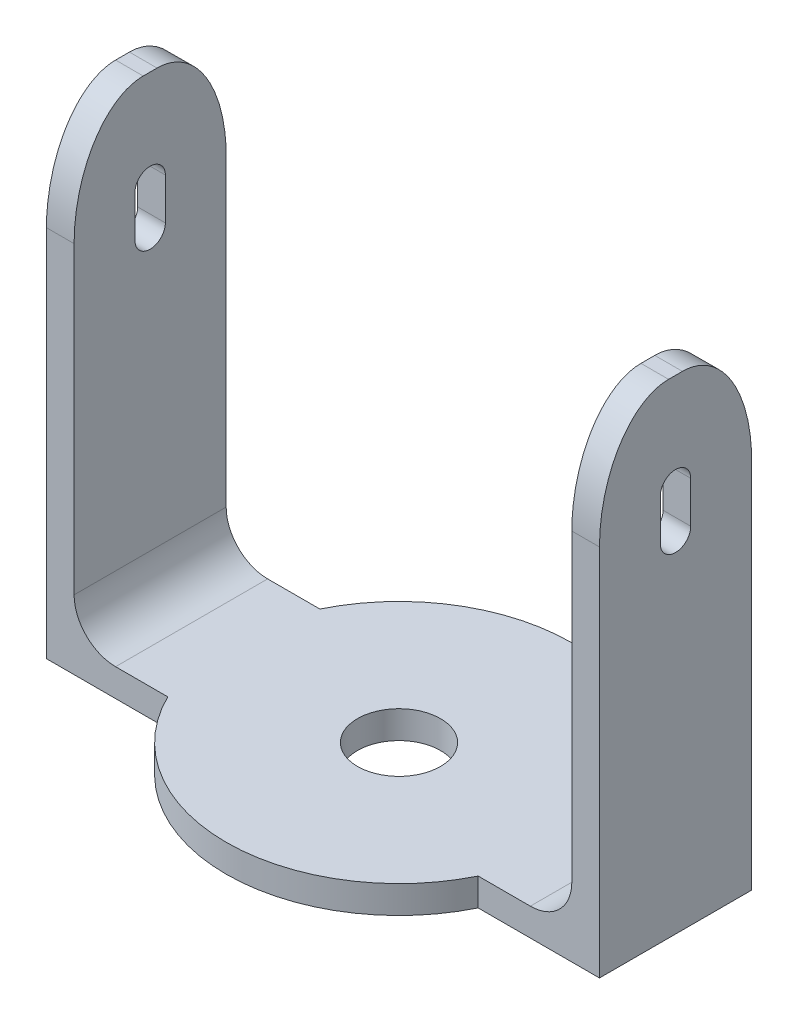
ISO-10303-21;
HEADER;
FILE_DESCRIPTION(('STEP AP214'),'2;1');
FILE_NAME('part.step','',(''),(''),'','','');
FILE_SCHEMA(('AUTOMOTIVE_DESIGN { 1 0 10303 214 1 1 1 1 }'));
ENDSEC;
DATA;
#1=APPLICATION_CONTEXT('core data for automotive mechanical design processes');
#2=APPLICATION_PROTOCOL_DEFINITION('international standard','automotive_design',2000,#1);
#3=PRODUCT_CONTEXT('',#1,'mechanical');
#4=PRODUCT('Part','Part','',(#3));
#5=PRODUCT_RELATED_PRODUCT_CATEGORY('part','',(#4));
#6=PRODUCT_DEFINITION_FORMATION('','',#4);
#7=PRODUCT_DEFINITION_CONTEXT('part definition',#1,'design');
#8=PRODUCT_DEFINITION('design','',#6,#7);
#9=PRODUCT_DEFINITION_SHAPE('','',#8);
#10=(LENGTH_UNIT() NAMED_UNIT(*) SI_UNIT(.MILLI.,.METRE.));
#11=(NAMED_UNIT(*) PLANE_ANGLE_UNIT() SI_UNIT($,.RADIAN.));
#12=(NAMED_UNIT(*) SI_UNIT($,.STERADIAN.) SOLID_ANGLE_UNIT());
#13=UNCERTAINTY_MEASURE_WITH_UNIT(LENGTH_MEASURE(1.E-05),#10,'distance_accuracy_value','');
#14=(GEOMETRIC_REPRESENTATION_CONTEXT(3) GLOBAL_UNCERTAINTY_ASSIGNED_CONTEXT((#13)) GLOBAL_UNIT_ASSIGNED_CONTEXT((#10,
#11,#12)) REPRESENTATION_CONTEXT('',''));
#15=CARTESIAN_POINT('',(0.,0.,0.));
#16=DIRECTION('',(0.,0.,1.));
#17=DIRECTION('',(1.,0.,0.));
#18=AXIS2_PLACEMENT_3D('',#15,#16,#17);
#19=CARTESIAN_POINT('',(0.,2.,0.));
#20=DIRECTION('',(0.,1.,0.));
#21=DIRECTION('',(0.,0.,1.));
#22=AXIS2_PLACEMENT_3D('',#19,#20,#21);
#23=PLANE('',#22);
#24=DIRECTION('',(1.,0.,0.));
#25=VECTOR('',#24,1.);
#26=CARTESIAN_POINT('',(18.,2.,5.5));
#27=LINE('',#26,#25);
#28=CARTESIAN_POINT('',(11.2249721603218,2.,5.5));
#29=VERTEX_POINT('',#28);
#30=CARTESIAN_POINT('',(15.,2.,5.5));
#31=VERTEX_POINT('',#30);
#32=EDGE_CURVE('E831',#29,#31,#27,.T.);
#33=ORIENTED_EDGE('',*,*,#32,.T.);
#34=DIRECTION('',(0.,0.,-1.));
#35=VECTOR('',#34,1.);
#36=CARTESIAN_POINT('',(15.,2.,0.));
#37=LINE('',#36,#35);
#38=CARTESIAN_POINT('',(15.,2.,-5.5));
#39=VERTEX_POINT('',#38);
#40=EDGE_CURVE('E263',#31,#39,#37,.T.);
#41=ORIENTED_EDGE('',*,*,#40,.T.);
#42=DIRECTION('',(-1.,0.,0.));
#43=VECTOR('',#42,1.);
#44=CARTESIAN_POINT('',(18.,2.,-5.5));
#45=LINE('',#44,#43);
#46=CARTESIAN_POINT('',(11.2249721603218,2.,-5.5));
#47=VERTEX_POINT('',#46);
#48=EDGE_CURVE('E316',#39,#47,#45,.T.);
#49=ORIENTED_EDGE('',*,*,#48,.T.);
#50=CARTESIAN_POINT('',(0.,2.,0.));
#51=DIRECTION('',(0.,1.,0.));
#52=DIRECTION('',(0.,0.,1.));
#53=AXIS2_PLACEMENT_3D('',#50,#51,#52);
#54=CIRCLE('',#53,12.5);
#55=CARTESIAN_POINT('',(-11.2249721603218,2.,-5.5));
#56=VERTEX_POINT('',#55);
#57=EDGE_CURVE('E313',#47,#56,#54,.T.);
#58=ORIENTED_EDGE('',*,*,#57,.T.);
#59=DIRECTION('',(-1.,0.,0.));
#60=VECTOR('',#59,1.);
#61=CARTESIAN_POINT('',(-11.2249721603218,2.,-5.5));
#62=LINE('',#61,#60);
#63=CARTESIAN_POINT('',(-15.,2.,-5.5));
#64=VERTEX_POINT('',#63);
#65=EDGE_CURVE('E315',#56,#64,#62,.T.);
#66=ORIENTED_EDGE('',*,*,#65,.T.);
#67=DIRECTION('',(0.,0.,1.));
#68=VECTOR('',#67,1.);
#69=CARTESIAN_POINT('',(-15.,2.,0.));
#70=LINE('',#69,#68);
#71=CARTESIAN_POINT('',(-15.,2.,5.5));
#72=VERTEX_POINT('',#71);
#73=EDGE_CURVE('E259',#64,#72,#70,.T.);
#74=ORIENTED_EDGE('',*,*,#73,.T.);
#75=DIRECTION('',(1.,0.,0.));
#76=VECTOR('',#75,1.);
#77=CARTESIAN_POINT('',(-11.2249721603218,2.,5.5));
#78=LINE('',#77,#76);
#79=CARTESIAN_POINT('',(-11.2249721603218,2.,5.5));
#80=VERTEX_POINT('',#79);
#81=EDGE_CURVE('E839',#72,#80,#78,.T.);
#82=ORIENTED_EDGE('',*,*,#81,.T.);
#83=CARTESIAN_POINT('',(0.,2.,0.));
#84=DIRECTION('',(0.,1.,0.));
#85=DIRECTION('',(0.,0.,1.));
#86=AXIS2_PLACEMENT_3D('',#83,#84,#85);
#87=CIRCLE('',#86,12.5);
#88=EDGE_CURVE('E827',#80,#29,#87,.T.);
#89=ORIENTED_EDGE('',*,*,#88,.T.);
#90=EDGE_LOOP('',(#33,#41,#49,#58,#66,#74,#82,#89));
#91=FACE_BOUND('',#90,.T.);
#92=CARTESIAN_POINT('',(0.,2.,0.));
#93=DIRECTION('',(0.,1.,0.));
#94=DIRECTION('',(0.,0.,1.));
#95=AXIS2_PLACEMENT_3D('',#92,#93,#94);
#96=CIRCLE('',#95,3.);
#97=CARTESIAN_POINT('',(0.,2.,3.));
#98=VERTEX_POINT('',#97);
#99=EDGE_CURVE('E340',#98,#98,#96,.T.);
#100=ORIENTED_EDGE('',*,*,#99,.F.);
#101=EDGE_LOOP('',(#100));
#102=FACE_BOUND('',#101,.T.);
#103=ADVANCED_FACE('F45',(#91,#102),#23,.T.);
#104=CARTESIAN_POINT('',(0.,0.,0.));
#105=DIRECTION('',(0.,1.,0.));
#106=DIRECTION('',(0.,0.,1.));
#107=AXIS2_PLACEMENT_3D('',#104,#105,#106);
#108=PLANE('',#107);
#109=CARTESIAN_POINT('',(0.,0.,0.));
#110=DIRECTION('',(0.,1.,0.));
#111=DIRECTION('',(0.,0.,1.));
#112=AXIS2_PLACEMENT_3D('',#109,#110,#111);
#113=CIRCLE('',#112,12.5);
#114=CARTESIAN_POINT('',(-11.2249721603218,0.,5.5));
#115=VERTEX_POINT('',#114);
#116=CARTESIAN_POINT('',(11.2249721603218,0.,5.5));
#117=VERTEX_POINT('',#116);
#118=EDGE_CURVE('E342',#115,#117,#113,.T.);
#119=ORIENTED_EDGE('',*,*,#118,.F.);
#120=DIRECTION('',(1.,0.,0.));
#121=VECTOR('',#120,1.);
#122=CARTESIAN_POINT('',(-11.2249721603218,0.,5.5));
#123=LINE('',#122,#121);
#124=CARTESIAN_POINT('',(-20.,0.,5.5));
#125=VERTEX_POINT('',#124);
#126=EDGE_CURVE('E832',#125,#115,#123,.T.);
#127=ORIENTED_EDGE('',*,*,#126,.F.);
#128=DIRECTION('',(0.,0.,1.));
#129=VECTOR('',#128,1.);
#130=CARTESIAN_POINT('',(-20.,0.,-5.5));
#131=LINE('',#130,#129);
#132=CARTESIAN_POINT('',(-20.,0.,-5.5));
#133=VERTEX_POINT('',#132);
#134=EDGE_CURVE('E334',#133,#125,#131,.T.);
#135=ORIENTED_EDGE('',*,*,#134,.F.);
#136=DIRECTION('',(-1.,0.,0.));
#137=VECTOR('',#136,1.);
#138=CARTESIAN_POINT('',(-11.2249721603218,0.,-5.5));
#139=LINE('',#138,#137);
#140=CARTESIAN_POINT('',(-11.2249721603218,0.,-5.5));
#141=VERTEX_POINT('',#140);
#142=EDGE_CURVE('E855',#141,#133,#139,.T.);
#143=ORIENTED_EDGE('',*,*,#142,.F.);
#144=CARTESIAN_POINT('',(0.,0.,0.));
#145=DIRECTION('',(0.,1.,0.));
#146=DIRECTION('',(0.,0.,1.));
#147=AXIS2_PLACEMENT_3D('',#144,#145,#146);
#148=CIRCLE('',#147,12.5);
#149=CARTESIAN_POINT('',(11.2249721603218,0.,-5.5));
#150=VERTEX_POINT('',#149);
#151=EDGE_CURVE('E853',#150,#141,#148,.T.);
#152=ORIENTED_EDGE('',*,*,#151,.F.);
#153=DIRECTION('',(-1.,0.,0.));
#154=VECTOR('',#153,1.);
#155=CARTESIAN_POINT('',(18.,0.,-5.5));
#156=LINE('',#155,#154);
#157=CARTESIAN_POINT('',(20.,0.,-5.5));
#158=VERTEX_POINT('',#157);
#159=EDGE_CURVE('E850',#158,#150,#156,.T.);
#160=ORIENTED_EDGE('',*,*,#159,.F.);
#161=DIRECTION('',(0.,0.,-1.));
#162=VECTOR('',#161,1.);
#163=CARTESIAN_POINT('',(20.,0.,-5.5));
#164=LINE('',#163,#162);
#165=CARTESIAN_POINT('',(20.,0.,5.5));
#166=VERTEX_POINT('',#165);
#167=EDGE_CURVE('E384',#166,#158,#164,.T.);
#168=ORIENTED_EDGE('',*,*,#167,.F.);
#169=DIRECTION('',(1.,0.,0.));
#170=VECTOR('',#169,1.);
#171=CARTESIAN_POINT('',(18.,0.,5.5));
#172=LINE('',#171,#170);
#173=EDGE_CURVE('E846',#117,#166,#172,.T.);
#174=ORIENTED_EDGE('',*,*,#173,.F.);
#175=EDGE_LOOP('',(#119,#127,#135,#143,#152,#160,#168,#174));
#176=FACE_BOUND('',#175,.T.);
#177=CARTESIAN_POINT('',(0.,0.,0.));
#178=DIRECTION('',(0.,1.,0.));
#179=DIRECTION('',(0.,0.,1.));
#180=AXIS2_PLACEMENT_3D('',#177,#178,#179);
#181=CIRCLE('',#180,3.);
#182=CARTESIAN_POINT('',(0.,0.,3.));
#183=VERTEX_POINT('',#182);
#184=EDGE_CURVE('E343',#183,#183,#181,.T.);
#185=ORIENTED_EDGE('',*,*,#184,.T.);
#186=EDGE_LOOP('',(#185));
#187=FACE_BOUND('',#186,.T.);
#188=ADVANCED_FACE('F573',(#176,#187),#108,.F.);
#189=CARTESIAN_POINT('',(0.,2.,0.));
#190=DIRECTION('',(0.,-1.,0.));
#191=DIRECTION('',(0.,0.,-1.));
#192=AXIS2_PLACEMENT_3D('',#189,#190,#191);
#193=CYLINDRICAL_SURFACE('',#192,12.5);
#194=ORIENTED_EDGE('',*,*,#118,.T.);
#195=DIRECTION('',(0.,-1.,0.));
#196=VECTOR('',#195,1.);
#197=CARTESIAN_POINT('',(11.2249721603218,2.,5.5));
#198=LINE('',#197,#196);
#199=EDGE_CURVE('E396',#29,#117,#198,.T.);
#200=ORIENTED_EDGE('',*,*,#199,.F.);
#201=ORIENTED_EDGE('',*,*,#88,.F.);
#202=DIRECTION('',(0.,-1.,0.));
#203=VECTOR('',#202,1.);
#204=CARTESIAN_POINT('',(-11.2249721603218,2.,5.5));
#205=LINE('',#204,#203);
#206=EDGE_CURVE('E842',#80,#115,#205,.T.);
#207=ORIENTED_EDGE('',*,*,#206,.T.);
#208=EDGE_LOOP('',(#194,#200,#201,#207));
#209=FACE_BOUND('',#208,.T.);
#210=ADVANCED_FACE('F483',(#209),#193,.T.);
#211=CARTESIAN_POINT('',(18.,2.,5.5));
#212=DIRECTION('',(0.,0.,-1.));
#213=DIRECTION('',(-1.,0.,0.));
#214=AXIS2_PLACEMENT_3D('',#211,#212,#213);
#215=PLANE('',#214);
#216=DIRECTION('',(0.,-1.,0.));
#217=VECTOR('',#216,1.);
#218=CARTESIAN_POINT('',(20.,35.,5.5));
#219=LINE('',#218,#217);
#220=CARTESIAN_POINT('',(20.,27.,5.5));
#221=VERTEX_POINT('',#220);
#222=EDGE_CURVE('E311',#221,#166,#219,.T.);
#223=ORIENTED_EDGE('',*,*,#222,.F.);
#224=CARTESIAN_POINT('',(17.9,27.,5.5));
#225=CARTESIAN_POINT('',(18.6333333333333,27.,5.5));
#226=CARTESIAN_POINT('',(19.3666666666667,27.,5.5));
#227=CARTESIAN_POINT('',(20.1,27.,5.5));
#228=(BOUNDED_CURVE() B_SPLINE_CURVE(3,(#224,#225,#226,#227),.UNSPECIFIED.,.F.,
.F.) B_SPLINE_CURVE_WITH_KNOTS((4,4),(0.0179,0.0201),
.UNSPECIFIED.) CURVE() GEOMETRIC_REPRESENTATION_ITEM() RATIONAL_B_SPLINE_CURVE((1.,1.,1.,1.)) REPRESENTATION_ITEM(''));
#229=CARTESIAN_POINT('',(18.,27.,5.5));
#230=VERTEX_POINT('',#229);
#231=EDGE_CURVE('E673',#221,#230,#228,.F.);
#232=ORIENTED_EDGE('',*,*,#231,.T.);
#233=DIRECTION('',(0.,-1.,0.));
#234=VECTOR('',#233,1.);
#235=CARTESIAN_POINT('',(18.,35.,5.5));
#236=LINE('',#235,#234);
#237=CARTESIAN_POINT('',(18.,5.,5.5));
#238=VERTEX_POINT('',#237);
#239=EDGE_CURVE('E307',#230,#238,#236,.T.);
#240=ORIENTED_EDGE('',*,*,#239,.T.);
#241=CARTESIAN_POINT('',(15.,5.,5.5));
#242=DIRECTION('',(0.,0.,-1.));
#243=DIRECTION('',(-1.,0.,0.));
#244=AXIS2_PLACEMENT_3D('',#241,#242,#243);
#245=CIRCLE('',#244,3.);
#246=EDGE_CURVE('E275',#238,#31,#245,.T.);
#247=ORIENTED_EDGE('',*,*,#246,.T.);
#248=ORIENTED_EDGE('',*,*,#32,.F.);
#249=ORIENTED_EDGE('',*,*,#199,.T.);
#250=ORIENTED_EDGE('',*,*,#173,.T.);
#251=EDGE_LOOP('',(#223,#232,#240,#247,#248,#249,#250));
#252=FACE_BOUND('',#251,.T.);
#253=ADVANCED_FACE('F478',(#252),#215,.F.);
#254=CARTESIAN_POINT('',(18.,2.,-5.5));
#255=DIRECTION('',(0.,0.,1.));
#256=DIRECTION('',(1.,0.,0.));
#257=AXIS2_PLACEMENT_3D('',#254,#255,#256);
#258=PLANE('',#257);
#259=DIRECTION('',(0.,-1.,0.));
#260=VECTOR('',#259,1.);
#261=CARTESIAN_POINT('',(18.,35.,-5.5));
#262=LINE('',#261,#260);
#263=CARTESIAN_POINT('',(18.,27.,-5.5));
#264=VERTEX_POINT('',#263);
#265=CARTESIAN_POINT('',(18.,5.,-5.5));
#266=VERTEX_POINT('',#265);
#267=EDGE_CURVE('E310',#264,#266,#262,.T.);
#268=ORIENTED_EDGE('',*,*,#267,.F.);
#269=CARTESIAN_POINT('',(20.1,27.,-5.5));
#270=CARTESIAN_POINT('',(19.3666666666667,27.,-5.5));
#271=CARTESIAN_POINT('',(18.6333333333333,27.,-5.5));
#272=CARTESIAN_POINT('',(17.9,27.,-5.5));
#273=(BOUNDED_CURVE() B_SPLINE_CURVE(3,(#269,#270,#271,#272),.UNSPECIFIED.,.F.,
.F.) B_SPLINE_CURVE_WITH_KNOTS((4,4),(-0.0201,-0.0179),
.UNSPECIFIED.) CURVE() GEOMETRIC_REPRESENTATION_ITEM() RATIONAL_B_SPLINE_CURVE((1.,1.,1.,1.)) REPRESENTATION_ITEM(''));
#274=CARTESIAN_POINT('',(20.,27.,-5.5));
#275=VERTEX_POINT('',#274);
#276=EDGE_CURVE('E460',#264,#275,#273,.F.);
#277=ORIENTED_EDGE('',*,*,#276,.T.);
#278=DIRECTION('',(0.,-1.,0.));
#279=VECTOR('',#278,1.);
#280=CARTESIAN_POINT('',(20.,35.,-5.5));
#281=LINE('',#280,#279);
#282=EDGE_CURVE('E338',#275,#158,#281,.T.);
#283=ORIENTED_EDGE('',*,*,#282,.T.);
#284=ORIENTED_EDGE('',*,*,#159,.T.);
#285=DIRECTION('',(0.,-1.,0.));
#286=VECTOR('',#285,1.);
#287=CARTESIAN_POINT('',(11.2249721603218,2.,-5.5));
#288=LINE('',#287,#286);
#289=EDGE_CURVE('E867',#47,#150,#288,.T.);
#290=ORIENTED_EDGE('',*,*,#289,.F.);
#291=ORIENTED_EDGE('',*,*,#48,.F.);
#292=CARTESIAN_POINT('',(15.,5.,-5.5));
#293=DIRECTION('',(0.,0.,1.));
#294=DIRECTION('',(1.,0.,0.));
#295=AXIS2_PLACEMENT_3D('',#292,#293,#294);
#296=CIRCLE('',#295,3.);
#297=EDGE_CURVE('E272',#39,#266,#296,.T.);
#298=ORIENTED_EDGE('',*,*,#297,.T.);
#299=EDGE_LOOP('',(#268,#277,#283,#284,#290,#291,#298));
#300=FACE_BOUND('',#299,.T.);
#301=ADVANCED_FACE('F467',(#300),#258,.F.);
#302=CARTESIAN_POINT('',(0.,2.,0.));
#303=DIRECTION('',(0.,-1.,0.));
#304=DIRECTION('',(0.,0.,-1.));
#305=AXIS2_PLACEMENT_3D('',#302,#303,#304);
#306=CYLINDRICAL_SURFACE('',#305,12.5);
#307=ORIENTED_EDGE('',*,*,#151,.T.);
#308=DIRECTION('',(0.,-1.,0.));
#309=VECTOR('',#308,1.);
#310=CARTESIAN_POINT('',(-11.2249721603218,2.,-5.5));
#311=LINE('',#310,#309);
#312=EDGE_CURVE('E864',#56,#141,#311,.T.);
#313=ORIENTED_EDGE('',*,*,#312,.F.);
#314=ORIENTED_EDGE('',*,*,#57,.F.);
#315=ORIENTED_EDGE('',*,*,#289,.T.);
#316=EDGE_LOOP('',(#307,#313,#314,#315));
#317=FACE_BOUND('',#316,.T.);
#318=ADVANCED_FACE('F477',(#317),#306,.T.);
#319=CARTESIAN_POINT('',(-11.2249721603218,2.,-5.5));
#320=DIRECTION('',(0.,0.,1.));
#321=DIRECTION('',(1.,0.,0.));
#322=AXIS2_PLACEMENT_3D('',#319,#320,#321);
#323=PLANE('',#322);
#324=DIRECTION('',(0.,-1.,0.));
#325=VECTOR('',#324,1.);
#326=CARTESIAN_POINT('',(-20.,35.,-5.5));
#327=LINE('',#326,#325);
#328=CARTESIAN_POINT('',(-20.,27.,-5.5));
#329=VERTEX_POINT('',#328);
#330=EDGE_CURVE('E332',#329,#133,#327,.T.);
#331=ORIENTED_EDGE('',*,*,#330,.F.);
#332=CARTESIAN_POINT('',(-17.9,27.,-5.5));
#333=CARTESIAN_POINT('',(-18.6333333333333,27.,-5.5));
#334=CARTESIAN_POINT('',(-19.3666666666667,27.,-5.5));
#335=CARTESIAN_POINT('',(-20.1,27.,-5.5));
#336=(BOUNDED_CURVE() B_SPLINE_CURVE(3,(#332,#333,#334,#335),.UNSPECIFIED.,.F.,
.F.) B_SPLINE_CURVE_WITH_KNOTS((4,4),(-0.0201,-0.0179),
.UNSPECIFIED.) CURVE() GEOMETRIC_REPRESENTATION_ITEM() RATIONAL_B_SPLINE_CURVE((1.,1.,1.,1.)) REPRESENTATION_ITEM(''));
#337=CARTESIAN_POINT('',(-18.,27.,-5.5));
#338=VERTEX_POINT('',#337);
#339=EDGE_CURVE('E286',#329,#338,#336,.F.);
#340=ORIENTED_EDGE('',*,*,#339,.T.);
#341=DIRECTION('',(0.,-1.,0.));
#342=VECTOR('',#341,1.);
#343=CARTESIAN_POINT('',(-18.,35.,-5.5));
#344=LINE('',#343,#342);
#345=CARTESIAN_POINT('',(-18.,5.,-5.5));
#346=VERTEX_POINT('',#345);
#347=EDGE_CURVE('E284',#338,#346,#344,.T.);
#348=ORIENTED_EDGE('',*,*,#347,.T.);
#349=CARTESIAN_POINT('',(-15.,5.,-5.5));
#350=DIRECTION('',(0.,0.,1.));
#351=DIRECTION('',(1.,0.,0.));
#352=AXIS2_PLACEMENT_3D('',#349,#350,#351);
#353=CIRCLE('',#352,3.);
#354=EDGE_CURVE('E12',#346,#64,#353,.T.);
#355=ORIENTED_EDGE('',*,*,#354,.T.);
#356=ORIENTED_EDGE('',*,*,#65,.F.);
#357=ORIENTED_EDGE('',*,*,#312,.T.);
#358=ORIENTED_EDGE('',*,*,#142,.T.);
#359=EDGE_LOOP('',(#331,#340,#348,#355,#356,#357,#358));
#360=FACE_BOUND('',#359,.T.);
#361=ADVANCED_FACE('F560',(#360),#323,.F.);
#362=CARTESIAN_POINT('',(-11.2249721603218,2.,5.5));
#363=DIRECTION('',(0.,0.,-1.));
#364=DIRECTION('',(-1.,0.,0.));
#365=AXIS2_PLACEMENT_3D('',#362,#363,#364);
#366=PLANE('',#365);
#367=DIRECTION('',(0.,-1.,0.));
#368=VECTOR('',#367,1.);
#369=CARTESIAN_POINT('',(-18.,35.,5.5));
#370=LINE('',#369,#368);
#371=CARTESIAN_POINT('',(-18.,27.,5.5));
#372=VERTEX_POINT('',#371);
#373=CARTESIAN_POINT('',(-18.,5.,5.5));
#374=VERTEX_POINT('',#373);
#375=EDGE_CURVE('E281',#372,#374,#370,.T.);
#376=ORIENTED_EDGE('',*,*,#375,.F.);
#377=CARTESIAN_POINT('',(-20.1,27.,5.5));
#378=CARTESIAN_POINT('',(-19.3666666666667,27.,5.5));
#379=CARTESIAN_POINT('',(-18.6333333333333,27.,5.5));
#380=CARTESIAN_POINT('',(-17.9,27.,5.5));
#381=(BOUNDED_CURVE() B_SPLINE_CURVE(3,(#377,#378,#379,#380),.UNSPECIFIED.,.F.,
.F.) B_SPLINE_CURVE_WITH_KNOTS((4,4),(0.0179,0.0201),
.UNSPECIFIED.) CURVE() GEOMETRIC_REPRESENTATION_ITEM() RATIONAL_B_SPLINE_CURVE((1.,1.,1.,1.)) REPRESENTATION_ITEM(''));
#382=CARTESIAN_POINT('',(-20.,27.,5.5));
#383=VERTEX_POINT('',#382);
#384=EDGE_CURVE('E231',#372,#383,#381,.F.);
#385=ORIENTED_EDGE('',*,*,#384,.T.);
#386=DIRECTION('',(0.,-1.,0.));
#387=VECTOR('',#386,1.);
#388=CARTESIAN_POINT('',(-20.,35.,5.5));
#389=LINE('',#388,#387);
#390=EDGE_CURVE('E283',#383,#125,#389,.T.);
#391=ORIENTED_EDGE('',*,*,#390,.T.);
#392=ORIENTED_EDGE('',*,*,#126,.T.);
#393=ORIENTED_EDGE('',*,*,#206,.F.);
#394=ORIENTED_EDGE('',*,*,#81,.F.);
#395=CARTESIAN_POINT('',(-15.,5.,5.5));
#396=DIRECTION('',(0.,0.,-1.));
#397=DIRECTION('',(-1.,0.,0.));
#398=AXIS2_PLACEMENT_3D('',#395,#396,#397);
#399=CIRCLE('',#398,3.);
#400=EDGE_CURVE('E54',#72,#374,#399,.T.);
#401=ORIENTED_EDGE('',*,*,#400,.T.);
#402=EDGE_LOOP('',(#376,#385,#391,#392,#393,#394,#401));
#403=FACE_BOUND('',#402,.T.);
#404=ADVANCED_FACE('F569',(#403),#366,.F.);
#405=CARTESIAN_POINT('',(0.,2.,0.));
#406=DIRECTION('',(0.,-1.,0.));
#407=DIRECTION('',(0.,0.,-1.));
#408=AXIS2_PLACEMENT_3D('',#405,#406,#407);
#409=CYLINDRICAL_SURFACE('',#408,3.);
#410=ORIENTED_EDGE('',*,*,#99,.T.);
#411=EDGE_LOOP('',(#410));
#412=FACE_BOUND('',#411,.T.);
#413=ORIENTED_EDGE('',*,*,#184,.F.);
#414=EDGE_LOOP('',(#413));
#415=FACE_BOUND('',#414,.T.);
#416=ADVANCED_FACE('F539',(#412,#415),#409,.F.);
#417=CARTESIAN_POINT('',(-20.,35.,-5.5));
#418=DIRECTION('',(1.,0.,0.));
#419=DIRECTION('',(0.,0.,-1.));
#420=AXIS2_PLACEMENT_3D('',#417,#418,#419);
#421=PLANE('',#420);
#422=DIRECTION('',(0.,1.,0.));
#423=VECTOR('',#422,1.);
#424=CARTESIAN_POINT('',(-20.,35.,-1.1));
#425=LINE('',#424,#423);
#426=CARTESIAN_POINT('',(-20.,25.,-1.1));
#427=VERTEX_POINT('',#426);
#428=CARTESIAN_POINT('',(-20.,28.,-1.1));
#429=VERTEX_POINT('',#428);
#430=EDGE_CURVE('E299',#427,#429,#425,.T.);
#431=ORIENTED_EDGE('',*,*,#430,.T.);
#432=CARTESIAN_POINT('',(-20.,28.,0.));
#433=DIRECTION('',(1.,0.,0.));
#434=DIRECTION('',(0.,0.,-1.));
#435=AXIS2_PLACEMENT_3D('',#432,#433,#434);
#436=CIRCLE('',#435,1.1);
#437=CARTESIAN_POINT('',(-20.,28.,1.1));
#438=VERTEX_POINT('',#437);
#439=EDGE_CURVE('E304',#429,#438,#436,.T.);
#440=ORIENTED_EDGE('',*,*,#439,.T.);
#441=DIRECTION('',(0.,-1.,0.));
#442=VECTOR('',#441,1.);
#443=CARTESIAN_POINT('',(-20.,35.,1.1));
#444=LINE('',#443,#442);
#445=CARTESIAN_POINT('',(-20.,25.,1.1));
#446=VERTEX_POINT('',#445);
#447=EDGE_CURVE('E374',#438,#446,#444,.T.);
#448=ORIENTED_EDGE('',*,*,#447,.T.);
#449=CARTESIAN_POINT('',(-20.,25.,0.));
#450=DIRECTION('',(1.,0.,0.));
#451=DIRECTION('',(0.,0.,-1.));
#452=AXIS2_PLACEMENT_3D('',#449,#450,#451);
#453=CIRCLE('',#452,1.1);
#454=EDGE_CURVE('E365',#446,#427,#453,.T.);
#455=ORIENTED_EDGE('',*,*,#454,.T.);
#456=EDGE_LOOP('',(#431,#440,#448,#455));
#457=FACE_BOUND('',#456,.T.);
#458=DIRECTION('',(0.,0.,1.));
#459=VECTOR('',#458,1.);
#460=CARTESIAN_POINT('',(-20.,35.,-5.5));
#461=LINE('',#460,#459);
#462=CARTESIAN_POINT('',(-20.,35.,-0.499999999999999));
#463=VERTEX_POINT('',#462);
#464=CARTESIAN_POINT('',(-20.,35.,0.5));
#465=VERTEX_POINT('',#464);
#466=EDGE_CURVE('E337',#463,#465,#461,.T.);
#467=ORIENTED_EDGE('',*,*,#466,.F.);
#468=CARTESIAN_POINT('',(-20.,27.,-5.5));
#469=CARTESIAN_POINT('',(-20.,35.,-5.5));
#470=CARTESIAN_POINT('',(-20.,35.,-0.499999999999998));
#471=(BOUNDED_CURVE() B_SPLINE_CURVE(2,(#468,#469,#470),.UNSPECIFIED.,.F.,
.F.) B_SPLINE_CURVE_WITH_KNOTS((3,3),(0.,1.),
.UNSPECIFIED.) CURVE() GEOMETRIC_REPRESENTATION_ITEM() RATIONAL_B_SPLINE_CURVE((1.,
0.707106781186547,1.)) REPRESENTATION_ITEM(''));
#472=EDGE_CURVE('E289',#463,#329,#471,.F.);
#473=ORIENTED_EDGE('',*,*,#472,.T.);
#474=ORIENTED_EDGE('',*,*,#330,.T.);
#475=ORIENTED_EDGE('',*,*,#134,.T.);
#476=ORIENTED_EDGE('',*,*,#390,.F.);
#477=CARTESIAN_POINT('',(-20.,35.,0.500000000000001));
#478=CARTESIAN_POINT('',(-20.,35.,5.50000000000001));
#479=CARTESIAN_POINT('',(-20.,27.,5.5));
#480=(BOUNDED_CURVE() B_SPLINE_CURVE(2,(#477,#478,#479),.UNSPECIFIED.,.F.,
.F.) B_SPLINE_CURVE_WITH_KNOTS((3,3),(0.,1.),
.UNSPECIFIED.) CURVE() GEOMETRIC_REPRESENTATION_ITEM() RATIONAL_B_SPLINE_CURVE((1.,
0.707106781186547,1.)) REPRESENTATION_ITEM(''));
#481=EDGE_CURVE('E329',#383,#465,#480,.F.);
#482=ORIENTED_EDGE('',*,*,#481,.T.);
#483=EDGE_LOOP('',(#467,#473,#474,#475,#476,#482));
#484=FACE_BOUND('',#483,.T.);
#485=ADVANCED_FACE('F528',(#457,#484),#421,.F.);
#486=CARTESIAN_POINT('',(-18.,35.,-5.5));
#487=DIRECTION('',(-1.,0.,0.));
#488=DIRECTION('',(0.,0.,1.));
#489=AXIS2_PLACEMENT_3D('',#486,#487,#488);
#490=PLANE('',#489);
#491=DIRECTION('',(0.,1.,0.));
#492=VECTOR('',#491,1.);
#493=CARTESIAN_POINT('',(-18.,35.,1.1));
#494=LINE('',#493,#492);
#495=CARTESIAN_POINT('',(-18.,25.,1.1));
#496=VERTEX_POINT('',#495);
#497=CARTESIAN_POINT('',(-18.,28.,1.1));
#498=VERTEX_POINT('',#497);
#499=EDGE_CURVE('E370',#496,#498,#494,.T.);
#500=ORIENTED_EDGE('',*,*,#499,.T.);
#501=CARTESIAN_POINT('',(-18.,28.,0.));
#502=DIRECTION('',(-1.,0.,0.));
#503=DIRECTION('',(0.,0.,1.));
#504=AXIS2_PLACEMENT_3D('',#501,#502,#503);
#505=CIRCLE('',#504,1.1);
#506=CARTESIAN_POINT('',(-18.,28.,-1.1));
#507=VERTEX_POINT('',#506);
#508=EDGE_CURVE('E301',#498,#507,#505,.T.);
#509=ORIENTED_EDGE('',*,*,#508,.T.);
#510=DIRECTION('',(0.,-1.,0.));
#511=VECTOR('',#510,1.);
#512=CARTESIAN_POINT('',(-18.,35.,-1.1));
#513=LINE('',#512,#511);
#514=CARTESIAN_POINT('',(-18.,25.,-1.1));
#515=VERTEX_POINT('',#514);
#516=EDGE_CURVE('E296',#507,#515,#513,.T.);
#517=ORIENTED_EDGE('',*,*,#516,.T.);
#518=CARTESIAN_POINT('',(-18.,25.,0.));
#519=DIRECTION('',(-1.,0.,0.));
#520=DIRECTION('',(0.,0.,1.));
#521=AXIS2_PLACEMENT_3D('',#518,#519,#520);
#522=CIRCLE('',#521,1.1);
#523=EDGE_CURVE('E361',#515,#496,#522,.T.);
#524=ORIENTED_EDGE('',*,*,#523,.T.);
#525=EDGE_LOOP('',(#500,#509,#517,#524));
#526=FACE_BOUND('',#525,.T.);
#527=ORIENTED_EDGE('',*,*,#375,.T.);
#528=DIRECTION('',(0.,0.,1.));
#529=VECTOR('',#528,1.);
#530=CARTESIAN_POINT('',(-18.,5.,-5.5));
#531=LINE('',#530,#529);
#532=EDGE_CURVE('E67',#374,#346,#531,.F.);
#533=ORIENTED_EDGE('',*,*,#532,.T.);
#534=ORIENTED_EDGE('',*,*,#347,.F.);
#535=CARTESIAN_POINT('',(-18.,35.,-0.499999999999998));
#536=CARTESIAN_POINT('',(-18.,35.,-5.5));
#537=CARTESIAN_POINT('',(-18.,27.,-5.5));
#538=(BOUNDED_CURVE() B_SPLINE_CURVE(2,(#535,#536,#537),.UNSPECIFIED.,.F.,
.F.) B_SPLINE_CURVE_WITH_KNOTS((3,3),(0.,1.),
.UNSPECIFIED.) CURVE() GEOMETRIC_REPRESENTATION_ITEM() RATIONAL_B_SPLINE_CURVE((1.,
0.707106781186547,1.)) REPRESENTATION_ITEM(''));
#539=CARTESIAN_POINT('',(-18.,35.,-0.499999999999998));
#540=VERTEX_POINT('',#539);
#541=EDGE_CURVE('E775',#338,#540,#538,.F.);
#542=ORIENTED_EDGE('',*,*,#541,.T.);
#543=DIRECTION('',(0.,0.,-1.));
#544=VECTOR('',#543,1.);
#545=CARTESIAN_POINT('',(-18.,35.,-5.5));
#546=LINE('',#545,#544);
#547=CARTESIAN_POINT('',(-18.,35.,0.500000000000001));
#548=VERTEX_POINT('',#547);
#549=EDGE_CURVE('E500',#548,#540,#546,.T.);
#550=ORIENTED_EDGE('',*,*,#549,.F.);
#551=CARTESIAN_POINT('',(-18.,27.,5.5));
#552=CARTESIAN_POINT('',(-18.,35.,5.50000000000001));
#553=CARTESIAN_POINT('',(-18.,35.,0.500000000000001));
#554=(BOUNDED_CURVE() B_SPLINE_CURVE(2,(#551,#552,#553),.UNSPECIFIED.,.F.,
.F.) B_SPLINE_CURVE_WITH_KNOTS((3,3),(0.,1.),
.UNSPECIFIED.) CURVE() GEOMETRIC_REPRESENTATION_ITEM() RATIONAL_B_SPLINE_CURVE((1.,
0.707106781186547,1.)) REPRESENTATION_ITEM(''));
#555=EDGE_CURVE('E288',#548,#372,#554,.F.);
#556=ORIENTED_EDGE('',*,*,#555,.T.);
#557=EDGE_LOOP('',(#527,#533,#534,#542,#550,#556));
#558=FACE_BOUND('',#557,.T.);
#559=ADVANCED_FACE('F538',(#526,#558),#490,.F.);
#560=CARTESIAN_POINT('',(0.,35.,0.));
#561=DIRECTION('',(0.,1.,0.));
#562=DIRECTION('',(0.,0.,1.));
#563=AXIS2_PLACEMENT_3D('',#560,#561,#562);
#564=PLANE('',#563);
#565=ORIENTED_EDGE('',*,*,#549,.T.);
#566=CARTESIAN_POINT('',(-20.1,35.,-0.499999999999998));
#567=CARTESIAN_POINT('',(-19.3666666666667,35.,-0.499999999999998));
#568=CARTESIAN_POINT('',(-18.6333333333333,35.,-0.499999999999998));
#569=CARTESIAN_POINT('',(-17.9,35.,-0.499999999999998));
#570=(BOUNDED_CURVE() B_SPLINE_CURVE(3,(#566,#567,#568,#569),.UNSPECIFIED.,.F.,
.F.) B_SPLINE_CURVE_WITH_KNOTS((4,4),(-0.0201,-0.0179),
.UNSPECIFIED.) CURVE() GEOMETRIC_REPRESENTATION_ITEM() RATIONAL_B_SPLINE_CURVE((1.,1.,1.,1.)) REPRESENTATION_ITEM(''));
#571=EDGE_CURVE('E326',#540,#463,#570,.F.);
#572=ORIENTED_EDGE('',*,*,#571,.T.);
#573=ORIENTED_EDGE('',*,*,#466,.T.);
#574=CARTESIAN_POINT('',(-17.9,35.,0.500000000000001));
#575=CARTESIAN_POINT('',(-18.6333333333333,35.,0.500000000000001));
#576=CARTESIAN_POINT('',(-19.3666666666667,35.,0.500000000000001));
#577=CARTESIAN_POINT('',(-20.1,35.,0.500000000000001));
#578=(BOUNDED_CURVE() B_SPLINE_CURVE(3,(#574,#575,#576,#577),.UNSPECIFIED.,.F.,
.F.) B_SPLINE_CURVE_WITH_KNOTS((4,4),(0.0179,0.0201),
.UNSPECIFIED.) CURVE() GEOMETRIC_REPRESENTATION_ITEM() RATIONAL_B_SPLINE_CURVE((1.,1.,1.,1.)) REPRESENTATION_ITEM(''));
#579=EDGE_CURVE('E330',#465,#548,#578,.F.);
#580=ORIENTED_EDGE('',*,*,#579,.T.);
#581=EDGE_LOOP('',(#565,#572,#573,#580));
#582=FACE_BOUND('',#581,.T.);
#583=ADVANCED_FACE('F797',(#582),#564,.T.);
#584=CARTESIAN_POINT('',(20.,35.,-5.5));
#585=DIRECTION('',(-1.,0.,0.));
#586=DIRECTION('',(0.,0.,1.));
#587=AXIS2_PLACEMENT_3D('',#584,#585,#586);
#588=PLANE('',#587);
#589=DIRECTION('',(0.,1.,0.));
#590=VECTOR('',#589,1.);
#591=CARTESIAN_POINT('',(20.,35.,1.1));
#592=LINE('',#591,#590);
#593=CARTESIAN_POINT('',(20.,25.,1.1));
#594=VERTEX_POINT('',#593);
#595=CARTESIAN_POINT('',(20.,28.,1.1));
#596=VERTEX_POINT('',#595);
#597=EDGE_CURVE('E280',#594,#596,#592,.T.);
#598=ORIENTED_EDGE('',*,*,#597,.T.);
#599=CARTESIAN_POINT('',(20.,28.,0.));
#600=DIRECTION('',(-1.,0.,0.));
#601=DIRECTION('',(0.,0.,1.));
#602=AXIS2_PLACEMENT_3D('',#599,#600,#601);
#603=CIRCLE('',#602,1.1);
#604=CARTESIAN_POINT('',(20.,28.,-1.1));
#605=VERTEX_POINT('',#604);
#606=EDGE_CURVE('E305',#596,#605,#603,.T.);
#607=ORIENTED_EDGE('',*,*,#606,.T.);
#608=DIRECTION('',(0.,-1.,0.));
#609=VECTOR('',#608,1.);
#610=CARTESIAN_POINT('',(20.,35.,-1.1));
#611=LINE('',#610,#609);
#612=CARTESIAN_POINT('',(20.,25.,-1.1));
#613=VERTEX_POINT('',#612);
#614=EDGE_CURVE('E293',#605,#613,#611,.T.);
#615=ORIENTED_EDGE('',*,*,#614,.T.);
#616=CARTESIAN_POINT('',(20.,25.,0.));
#617=DIRECTION('',(-1.,0.,0.));
#618=DIRECTION('',(0.,0.,1.));
#619=AXIS2_PLACEMENT_3D('',#616,#617,#618);
#620=CIRCLE('',#619,1.1);
#621=EDGE_CURVE('E238',#613,#594,#620,.T.);
#622=ORIENTED_EDGE('',*,*,#621,.T.);
#623=EDGE_LOOP('',(#598,#607,#615,#622));
#624=FACE_BOUND('',#623,.T.);
#625=ORIENTED_EDGE('',*,*,#282,.F.);
#626=CARTESIAN_POINT('',(20.,35.,-0.500000000000002));
#627=CARTESIAN_POINT('',(20.,35.,-5.50000000000001));
#628=CARTESIAN_POINT('',(20.,27.,-5.5));
#629=(BOUNDED_CURVE() B_SPLINE_CURVE(2,(#626,#627,#628),.UNSPECIFIED.,.F.,
.F.) B_SPLINE_CURVE_WITH_KNOTS((3,3),(0.,1.),
.UNSPECIFIED.) CURVE() GEOMETRIC_REPRESENTATION_ITEM() RATIONAL_B_SPLINE_CURVE((1.,
0.707106781186548,1.)) REPRESENTATION_ITEM(''));
#630=CARTESIAN_POINT('',(20.,35.,-0.500000000000002));
#631=VERTEX_POINT('',#630);
#632=EDGE_CURVE('E802',#275,#631,#629,.F.);
#633=ORIENTED_EDGE('',*,*,#632,.T.);
#634=DIRECTION('',(0.,0.,-1.));
#635=VECTOR('',#634,1.);
#636=CARTESIAN_POINT('',(20.,35.,-5.5));
#637=LINE('',#636,#635);
#638=CARTESIAN_POINT('',(20.,35.,0.499999999999996));
#639=VERTEX_POINT('',#638);
#640=EDGE_CURVE('E390',#639,#631,#637,.T.);
#641=ORIENTED_EDGE('',*,*,#640,.F.);
#642=CARTESIAN_POINT('',(20.,27.,5.5));
#643=CARTESIAN_POINT('',(20.,35.,5.5));
#644=CARTESIAN_POINT('',(20.,35.,0.499999999999996));
#645=(BOUNDED_CURVE() B_SPLINE_CURVE(2,(#642,#643,#644),.UNSPECIFIED.,.F.,
.F.) B_SPLINE_CURVE_WITH_KNOTS((3,3),(0.,1.),
.UNSPECIFIED.) CURVE() GEOMETRIC_REPRESENTATION_ITEM() RATIONAL_B_SPLINE_CURVE((1.,
0.707106781186547,1.)) REPRESENTATION_ITEM(''));
#646=EDGE_CURVE('E644',#639,#221,#645,.F.);
#647=ORIENTED_EDGE('',*,*,#646,.T.);
#648=ORIENTED_EDGE('',*,*,#222,.T.);
#649=ORIENTED_EDGE('',*,*,#167,.T.);
#650=EDGE_LOOP('',(#625,#633,#641,#647,#648,#649));
#651=FACE_BOUND('',#650,.T.);
#652=ADVANCED_FACE('F881',(#624,#651),#588,.F.);
#653=CARTESIAN_POINT('',(18.,35.,-5.5));
#654=DIRECTION('',(1.,0.,0.));
#655=DIRECTION('',(0.,0.,-1.));
#656=AXIS2_PLACEMENT_3D('',#653,#654,#655);
#657=PLANE('',#656);
#658=DIRECTION('',(0.,1.,0.));
#659=VECTOR('',#658,1.);
#660=CARTESIAN_POINT('',(18.,35.,-1.1));
#661=LINE('',#660,#659);
#662=CARTESIAN_POINT('',(18.,25.,-1.1));
#663=VERTEX_POINT('',#662);
#664=CARTESIAN_POINT('',(18.,28.,-1.1));
#665=VERTEX_POINT('',#664);
#666=EDGE_CURVE('E218',#663,#665,#661,.T.);
#667=ORIENTED_EDGE('',*,*,#666,.T.);
#668=CARTESIAN_POINT('',(18.,28.,0.));
#669=DIRECTION('',(1.,0.,0.));
#670=DIRECTION('',(0.,0.,-1.));
#671=AXIS2_PLACEMENT_3D('',#668,#669,#670);
#672=CIRCLE('',#671,1.1);
#673=CARTESIAN_POINT('',(18.,28.,1.1));
#674=VERTEX_POINT('',#673);
#675=EDGE_CURVE('E253',#665,#674,#672,.T.);
#676=ORIENTED_EDGE('',*,*,#675,.T.);
#677=DIRECTION('',(0.,-1.,0.));
#678=VECTOR('',#677,1.);
#679=CARTESIAN_POINT('',(18.,35.,1.1));
#680=LINE('',#679,#678);
#681=CARTESIAN_POINT('',(18.,25.,1.1));
#682=VERTEX_POINT('',#681);
#683=EDGE_CURVE('E247',#674,#682,#680,.T.);
#684=ORIENTED_EDGE('',*,*,#683,.T.);
#685=CARTESIAN_POINT('',(18.,25.,0.));
#686=DIRECTION('',(1.,0.,0.));
#687=DIRECTION('',(0.,0.,-1.));
#688=AXIS2_PLACEMENT_3D('',#685,#686,#687);
#689=CIRCLE('',#688,1.1);
#690=EDGE_CURVE('E230',#682,#663,#689,.T.);
#691=ORIENTED_EDGE('',*,*,#690,.T.);
#692=EDGE_LOOP('',(#667,#676,#684,#691));
#693=FACE_BOUND('',#692,.T.);
#694=ORIENTED_EDGE('',*,*,#267,.T.);
#695=DIRECTION('',(0.,0.,-1.));
#696=VECTOR('',#695,1.);
#697=CARTESIAN_POINT('',(18.,5.,-5.5));
#698=LINE('',#697,#696);
#699=EDGE_CURVE('E267',#266,#238,#698,.F.);
#700=ORIENTED_EDGE('',*,*,#699,.T.);
#701=ORIENTED_EDGE('',*,*,#239,.F.);
#702=CARTESIAN_POINT('',(18.,35.,0.499999999999997));
#703=CARTESIAN_POINT('',(18.,35.,5.5));
#704=CARTESIAN_POINT('',(18.,27.,5.5));
#705=(BOUNDED_CURVE() B_SPLINE_CURVE(2,(#702,#703,#704),.UNSPECIFIED.,.F.,
.F.) B_SPLINE_CURVE_WITH_KNOTS((3,3),(0.,1.),
.UNSPECIFIED.) CURVE() GEOMETRIC_REPRESENTATION_ITEM() RATIONAL_B_SPLINE_CURVE((1.,
0.707106781186547,1.)) REPRESENTATION_ITEM(''));
#706=CARTESIAN_POINT('',(18.,35.,0.499999999999997));
#707=VERTEX_POINT('',#706);
#708=EDGE_CURVE('E322',#230,#707,#705,.F.);
#709=ORIENTED_EDGE('',*,*,#708,.T.);
#710=DIRECTION('',(0.,0.,1.));
#711=VECTOR('',#710,1.);
#712=CARTESIAN_POINT('',(18.,35.,-5.5));
#713=LINE('',#712,#711);
#714=CARTESIAN_POINT('',(18.,35.,-0.500000000000001));
#715=VERTEX_POINT('',#714);
#716=EDGE_CURVE('E395',#715,#707,#713,.T.);
#717=ORIENTED_EDGE('',*,*,#716,.F.);
#718=CARTESIAN_POINT('',(18.,27.,-5.5));
#719=CARTESIAN_POINT('',(18.,35.,-5.50000000000001));
#720=CARTESIAN_POINT('',(18.,35.,-0.500000000000001));
#721=(BOUNDED_CURVE() B_SPLINE_CURVE(2,(#718,#719,#720),.UNSPECIFIED.,.F.,
.F.) B_SPLINE_CURVE_WITH_KNOTS((3,3),(0.,1.),
.UNSPECIFIED.) CURVE() GEOMETRIC_REPRESENTATION_ITEM() RATIONAL_B_SPLINE_CURVE((1.,
0.707106781186547,1.)) REPRESENTATION_ITEM(''));
#722=EDGE_CURVE('E324',#715,#264,#721,.F.);
#723=ORIENTED_EDGE('',*,*,#722,.T.);
#724=EDGE_LOOP('',(#694,#700,#701,#709,#717,#723));
#725=FACE_BOUND('',#724,.T.);
#726=ADVANCED_FACE('F245',(#693,#725),#657,.F.);
#727=CARTESIAN_POINT('',(0.,35.,0.));
#728=DIRECTION('',(0.,-1.,0.));
#729=DIRECTION('',(0.,0.,-1.));
#730=AXIS2_PLACEMENT_3D('',#727,#728,#729);
#731=PLANE('',#730);
#732=ORIENTED_EDGE('',*,*,#640,.T.);
#733=CARTESIAN_POINT('',(17.9,35.,-0.500000000000001));
#734=CARTESIAN_POINT('',(18.6333333333333,35.,-0.500000000000001));
#735=CARTESIAN_POINT('',(19.3666666666667,35.,-0.500000000000002));
#736=CARTESIAN_POINT('',(20.1,35.,-0.500000000000002));
#737=(BOUNDED_CURVE() B_SPLINE_CURVE(3,(#733,#734,#735,#736),.UNSPECIFIED.,.F.,
.F.) B_SPLINE_CURVE_WITH_KNOTS((4,4),(-0.0201,-0.0179),
.UNSPECIFIED.) CURVE() GEOMETRIC_REPRESENTATION_ITEM() RATIONAL_B_SPLINE_CURVE((1.,1.,1.,1.)) REPRESENTATION_ITEM(''));
#738=EDGE_CURVE('E325',#631,#715,#737,.F.);
#739=ORIENTED_EDGE('',*,*,#738,.T.);
#740=ORIENTED_EDGE('',*,*,#716,.T.);
#741=CARTESIAN_POINT('',(20.1,35.,0.499999999999996));
#742=CARTESIAN_POINT('',(19.3666666666667,35.,0.499999999999996));
#743=CARTESIAN_POINT('',(18.6333333333333,35.,0.499999999999997));
#744=CARTESIAN_POINT('',(17.9,35.,0.499999999999997));
#745=(BOUNDED_CURVE() B_SPLINE_CURVE(3,(#741,#742,#743,#744),.UNSPECIFIED.,.F.,
.F.) B_SPLINE_CURVE_WITH_KNOTS((4,4),(0.0179,0.0201),
.UNSPECIFIED.) CURVE() GEOMETRIC_REPRESENTATION_ITEM() RATIONAL_B_SPLINE_CURVE((1.,1.,1.,1.)) REPRESENTATION_ITEM(''));
#746=EDGE_CURVE('E405',#707,#639,#745,.F.);
#747=ORIENTED_EDGE('',*,*,#746,.T.);
#748=EDGE_LOOP('',(#732,#739,#740,#747));
#749=FACE_BOUND('',#748,.T.);
#750=ADVANCED_FACE('F413',(#749),#731,.F.);
#751=CARTESIAN_POINT('',(20.1,35.,-0.500000000000002));
#752=CARTESIAN_POINT('',(19.3666666666667,35.,-0.500000000000002));
#753=CARTESIAN_POINT('',(18.6333333333333,35.,-0.500000000000001));
#754=CARTESIAN_POINT('',(17.9,35.,-0.500000000000001));
#755=CARTESIAN_POINT('',(20.1,35.,-5.50000000000001));
#756=CARTESIAN_POINT('',(19.3666666666667,35.,-5.50000000000001));
#757=CARTESIAN_POINT('',(18.6333333333333,35.,-5.50000000000001));
#758=CARTESIAN_POINT('',(17.9,35.,-5.50000000000001));
#759=CARTESIAN_POINT('',(20.1,27.,-5.5));
#760=CARTESIAN_POINT('',(19.3666666666667,27.,-5.5));
#761=CARTESIAN_POINT('',(18.6333333333333,27.,-5.5));
#762=CARTESIAN_POINT('',(17.9,27.,-5.5));
#763=(BOUNDED_SURFACE() B_SPLINE_SURFACE(2,3,((#751,#752,#753,#754),(#755,#756,#757,#758),(#759,
#760,#761,#762)),.UNSPECIFIED.,.F.,.F.,.F.) B_SPLINE_SURFACE_WITH_KNOTS((3,3),(4,4),(0.,1.),
(-0.0201,-0.0179),.UNSPECIFIED.) GEOMETRIC_REPRESENTATION_ITEM() RATIONAL_B_SPLINE_SURFACE(((1.,
1.,1.,1.),(0.707106781186547,0.707106781186547,0.707106781186547,0.707106781186547),(1.,1.,1.,1.))) REPRESENTATION_ITEM('') SURFACE());
#764=ORIENTED_EDGE('',*,*,#632,.F.);
#765=ORIENTED_EDGE('',*,*,#276,.F.);
#766=ORIENTED_EDGE('',*,*,#722,.F.);
#767=ORIENTED_EDGE('',*,*,#738,.F.);
#768=EDGE_LOOP('',(#764,#765,#766,#767));
#769=FACE_BOUND('',#768,.T.);
#770=ADVANCED_FACE('F423',(#769),#763,.T.);
#771=CARTESIAN_POINT('',(17.9,35.,0.499999999999997));
#772=CARTESIAN_POINT('',(18.6333333333333,35.,0.499999999999997));
#773=CARTESIAN_POINT('',(19.3666666666667,35.,0.499999999999996));
#774=CARTESIAN_POINT('',(20.1,35.,0.499999999999996));
#775=CARTESIAN_POINT('',(17.9,35.,5.5));
#776=CARTESIAN_POINT('',(18.6333333333333,35.,5.5));
#777=CARTESIAN_POINT('',(19.3666666666667,35.,5.5));
#778=CARTESIAN_POINT('',(20.1,35.,5.5));
#779=CARTESIAN_POINT('',(17.9,27.,5.5));
#780=CARTESIAN_POINT('',(18.6333333333333,27.,5.5));
#781=CARTESIAN_POINT('',(19.3666666666667,27.,5.5));
#782=CARTESIAN_POINT('',(20.1,27.,5.5));
#783=(BOUNDED_SURFACE() B_SPLINE_SURFACE(2,3,((#771,#772,#773,#774),(#775,#776,#777,#778),(#779,
#780,#781,#782)),.UNSPECIFIED.,.F.,.F.,.F.) B_SPLINE_SURFACE_WITH_KNOTS((3,3),(4,4),(0.,1.),
(0.0179,0.0201),.UNSPECIFIED.) GEOMETRIC_REPRESENTATION_ITEM() RATIONAL_B_SPLINE_SURFACE(((1.,
1.,1.,1.),(0.707106781186547,0.707106781186547,0.707106781186547,0.707106781186547),(1.,1.,1.,1.))) REPRESENTATION_ITEM('') SURFACE());
#784=ORIENTED_EDGE('',*,*,#708,.F.);
#785=ORIENTED_EDGE('',*,*,#231,.F.);
#786=ORIENTED_EDGE('',*,*,#646,.F.);
#787=ORIENTED_EDGE('',*,*,#746,.F.);
#788=EDGE_LOOP('',(#784,#785,#786,#787));
#789=FACE_BOUND('',#788,.T.);
#790=ADVANCED_FACE('F606',(#789),#783,.T.);
#791=CARTESIAN_POINT('',(-20.1,27.,-5.5));
#792=CARTESIAN_POINT('',(-19.3666666666667,27.,-5.5));
#793=CARTESIAN_POINT('',(-18.6333333333333,27.,-5.5));
#794=CARTESIAN_POINT('',(-17.9,27.,-5.5));
#795=CARTESIAN_POINT('',(-20.1,35.,-5.5));
#796=CARTESIAN_POINT('',(-19.3666666666667,35.,-5.5));
#797=CARTESIAN_POINT('',(-18.6333333333333,35.,-5.5));
#798=CARTESIAN_POINT('',(-17.9,35.,-5.5));
#799=CARTESIAN_POINT('',(-20.1,35.,-0.499999999999998));
#800=CARTESIAN_POINT('',(-19.3666666666667,35.,-0.499999999999998));
#801=CARTESIAN_POINT('',(-18.6333333333333,35.,-0.499999999999998));
#802=CARTESIAN_POINT('',(-17.9,35.,-0.499999999999998));
#803=(BOUNDED_SURFACE() B_SPLINE_SURFACE(2,3,((#791,#792,#793,#794),(#795,#796,#797,#798),(#799,
#800,#801,#802)),.UNSPECIFIED.,.F.,.F.,.F.) B_SPLINE_SURFACE_WITH_KNOTS((3,3),(4,4),(0.,1.),
(-0.0201,-0.0179),.UNSPECIFIED.) GEOMETRIC_REPRESENTATION_ITEM() RATIONAL_B_SPLINE_SURFACE(((1.,
1.,1.,1.),(0.707106781186547,0.707106781186547,0.707106781186547,0.707106781186547),(1.,1.,1.,1.))) REPRESENTATION_ITEM('') SURFACE());
#804=ORIENTED_EDGE('',*,*,#541,.F.);
#805=ORIENTED_EDGE('',*,*,#339,.F.);
#806=ORIENTED_EDGE('',*,*,#472,.F.);
#807=ORIENTED_EDGE('',*,*,#571,.F.);
#808=EDGE_LOOP('',(#804,#805,#806,#807));
#809=FACE_BOUND('',#808,.T.);
#810=ADVANCED_FACE('F690',(#809),#803,.T.);
#811=CARTESIAN_POINT('',(-17.9,27.,5.5));
#812=CARTESIAN_POINT('',(-18.6333333333333,27.,5.5));
#813=CARTESIAN_POINT('',(-19.3666666666667,27.,5.5));
#814=CARTESIAN_POINT('',(-20.1,27.,5.5));
#815=CARTESIAN_POINT('',(-17.9,35.,5.50000000000001));
#816=CARTESIAN_POINT('',(-18.6333333333333,35.,5.50000000000001));
#817=CARTESIAN_POINT('',(-19.3666666666667,35.,5.50000000000001));
#818=CARTESIAN_POINT('',(-20.1,35.,5.50000000000001));
#819=CARTESIAN_POINT('',(-17.9,35.,0.500000000000001));
#820=CARTESIAN_POINT('',(-18.6333333333333,35.,0.500000000000001));
#821=CARTESIAN_POINT('',(-19.3666666666667,35.,0.500000000000001));
#822=CARTESIAN_POINT('',(-20.1,35.,0.500000000000001));
#823=(BOUNDED_SURFACE() B_SPLINE_SURFACE(2,3,((#811,#812,#813,#814),(#815,#816,#817,#818),(#819,
#820,#821,#822)),.UNSPECIFIED.,.F.,.F.,.F.) B_SPLINE_SURFACE_WITH_KNOTS((3,3),(4,4),(0.,1.),
(0.0179,0.0201),.UNSPECIFIED.) GEOMETRIC_REPRESENTATION_ITEM() RATIONAL_B_SPLINE_SURFACE(((1.,
1.,1.,1.),(0.707106781186547,0.707106781186547,0.707106781186547,0.707106781186547),(1.,1.,1.,1.))) REPRESENTATION_ITEM('') SURFACE());
#824=ORIENTED_EDGE('',*,*,#481,.F.);
#825=ORIENTED_EDGE('',*,*,#384,.F.);
#826=ORIENTED_EDGE('',*,*,#555,.F.);
#827=ORIENTED_EDGE('',*,*,#579,.F.);
#828=EDGE_LOOP('',(#824,#825,#826,#827));
#829=FACE_BOUND('',#828,.T.);
#830=ADVANCED_FACE('F703',(#829),#823,.T.);
#831=CARTESIAN_POINT('',(20.04,25.,-1.1));
#832=DIRECTION('',(0.,0.,-1.));
#833=DIRECTION('',(-1.,0.,0.));
#834=AXIS2_PLACEMENT_3D('',#831,#832,#833);
#835=PLANE('',#834);
#836=DIRECTION('',(-1.,0.,0.));
#837=VECTOR('',#836,1.);
#838=CARTESIAN_POINT('',(20.04,28.,-1.1));
#839=LINE('',#838,#837);
#840=EDGE_CURVE('E224',#605,#665,#839,.T.);
#841=ORIENTED_EDGE('',*,*,#840,.T.);
#842=ORIENTED_EDGE('',*,*,#666,.F.);
#843=DIRECTION('',(-1.,0.,0.));
#844=VECTOR('',#843,1.);
#845=CARTESIAN_POINT('',(20.04,25.,-1.1));
#846=LINE('',#845,#844);
#847=EDGE_CURVE('E221',#613,#663,#846,.T.);
#848=ORIENTED_EDGE('',*,*,#847,.F.);
#849=ORIENTED_EDGE('',*,*,#614,.F.);
#850=EDGE_LOOP('',(#841,#842,#848,#849));
#851=FACE_BOUND('',#850,.T.);
#852=ADVANCED_FACE('F220',(#851),#835,.F.);
#853=CARTESIAN_POINT('',(20.04,25.,0.));
#854=DIRECTION('',(-1.,0.,0.));
#855=DIRECTION('',(0.,0.,1.));
#856=AXIS2_PLACEMENT_3D('',#853,#854,#855);
#857=CYLINDRICAL_SURFACE('',#856,1.1);
#858=ORIENTED_EDGE('',*,*,#847,.T.);
#859=ORIENTED_EDGE('',*,*,#690,.F.);
#860=DIRECTION('',(-1.,0.,0.));
#861=VECTOR('',#860,1.);
#862=CARTESIAN_POINT('',(20.04,25.,1.1));
#863=LINE('',#862,#861);
#864=EDGE_CURVE('E320',#594,#682,#863,.T.);
#865=ORIENTED_EDGE('',*,*,#864,.F.);
#866=ORIENTED_EDGE('',*,*,#621,.F.);
#867=EDGE_LOOP('',(#858,#859,#865,#866));
#868=FACE_BOUND('',#867,.T.);
#869=ADVANCED_FACE('F234',(#868),#857,.F.);
#870=CARTESIAN_POINT('',(20.04,28.,1.1));
#871=DIRECTION('',(0.,0.,1.));
#872=DIRECTION('',(1.,0.,0.));
#873=AXIS2_PLACEMENT_3D('',#870,#871,#872);
#874=PLANE('',#873);
#875=ORIENTED_EDGE('',*,*,#864,.T.);
#876=ORIENTED_EDGE('',*,*,#683,.F.);
#877=DIRECTION('',(-1.,0.,0.));
#878=VECTOR('',#877,1.);
#879=CARTESIAN_POINT('',(20.04,28.,1.1));
#880=LINE('',#879,#878);
#881=EDGE_CURVE('E290',#596,#674,#880,.T.);
#882=ORIENTED_EDGE('',*,*,#881,.F.);
#883=ORIENTED_EDGE('',*,*,#597,.F.);
#884=EDGE_LOOP('',(#875,#876,#882,#883));
#885=FACE_BOUND('',#884,.T.);
#886=ADVANCED_FACE('F968',(#885),#874,.F.);
#887=CARTESIAN_POINT('',(20.04,28.,0.));
#888=DIRECTION('',(-1.,0.,0.));
#889=DIRECTION('',(0.,0.,1.));
#890=AXIS2_PLACEMENT_3D('',#887,#888,#889);
#891=CYLINDRICAL_SURFACE('',#890,1.1);
#892=ORIENTED_EDGE('',*,*,#881,.T.);
#893=ORIENTED_EDGE('',*,*,#675,.F.);
#894=ORIENTED_EDGE('',*,*,#840,.F.);
#895=ORIENTED_EDGE('',*,*,#606,.F.);
#896=EDGE_LOOP('',(#892,#893,#894,#895));
#897=FACE_BOUND('',#896,.T.);
#898=ADVANCED_FACE('F977',(#897),#891,.F.);
#899=EDGE_CURVE('E350',#507,#429,#839,.T.);
#900=ORIENTED_EDGE('',*,*,#899,.F.);
#901=ORIENTED_EDGE('',*,*,#508,.F.);
#902=EDGE_CURVE('E294',#498,#438,#880,.T.);
#903=ORIENTED_EDGE('',*,*,#902,.T.);
#904=ORIENTED_EDGE('',*,*,#439,.F.);
#905=EDGE_LOOP('',(#900,#901,#903,#904));
#906=FACE_BOUND('',#905,.T.);
#907=ADVANCED_FACE('F424',(#906),#891,.F.);
#908=ORIENTED_EDGE('',*,*,#902,.F.);
#909=ORIENTED_EDGE('',*,*,#499,.F.);
#910=EDGE_CURVE('E241',#496,#446,#863,.T.);
#911=ORIENTED_EDGE('',*,*,#910,.T.);
#912=ORIENTED_EDGE('',*,*,#447,.F.);
#913=EDGE_LOOP('',(#908,#909,#911,#912));
#914=FACE_BOUND('',#913,.T.);
#915=ADVANCED_FACE('F980',(#914),#874,.F.);
#916=ORIENTED_EDGE('',*,*,#910,.F.);
#917=ORIENTED_EDGE('',*,*,#523,.F.);
#918=EDGE_CURVE('E242',#515,#427,#846,.T.);
#919=ORIENTED_EDGE('',*,*,#918,.T.);
#920=ORIENTED_EDGE('',*,*,#454,.F.);
#921=EDGE_LOOP('',(#916,#917,#919,#920));
#922=FACE_BOUND('',#921,.T.);
#923=ADVANCED_FACE('F970',(#922),#857,.F.);
#924=ORIENTED_EDGE('',*,*,#918,.F.);
#925=ORIENTED_EDGE('',*,*,#516,.F.);
#926=ORIENTED_EDGE('',*,*,#899,.T.);
#927=ORIENTED_EDGE('',*,*,#430,.F.);
#928=EDGE_LOOP('',(#924,#925,#926,#927));
#929=FACE_BOUND('',#928,.T.);
#930=ADVANCED_FACE('F961',(#929),#835,.F.);
#931=CARTESIAN_POINT('',(15.,5.,0.));
#932=DIRECTION('',(0.,0.,-1.));
#933=DIRECTION('',(-1.,0.,0.));
#934=AXIS2_PLACEMENT_3D('',#931,#932,#933);
#935=CYLINDRICAL_SURFACE('',#934,3.);
#936=ORIENTED_EDGE('',*,*,#246,.F.);
#937=ORIENTED_EDGE('',*,*,#699,.F.);
#938=ORIENTED_EDGE('',*,*,#297,.F.);
#939=ORIENTED_EDGE('',*,*,#40,.F.);
#940=EDGE_LOOP('',(#936,#937,#938,#939));
#941=FACE_BOUND('',#940,.T.);
#942=ADVANCED_FACE('F1014',(#941),#935,.F.);
#943=CARTESIAN_POINT('',(-15.,5.,0.));
#944=DIRECTION('',(0.,0.,1.));
#945=DIRECTION('',(1.,0.,0.));
#946=AXIS2_PLACEMENT_3D('',#943,#944,#945);
#947=CYLINDRICAL_SURFACE('',#946,3.);
#948=ORIENTED_EDGE('',*,*,#354,.F.);
#949=ORIENTED_EDGE('',*,*,#532,.F.);
#950=ORIENTED_EDGE('',*,*,#400,.F.);
#951=ORIENTED_EDGE('',*,*,#73,.F.);
#952=EDGE_LOOP('',(#948,#949,#950,#951));
#953=FACE_BOUND('',#952,.T.);
#954=ADVANCED_FACE('F47',(#953),#947,.F.);
#955=CLOSED_SHELL('',(#103,#188,#210,#253,#301,#318,#361,#404,#416,#485,#559,#583,#652,#726,
#750,#770,#790,#810,#830,#852,#869,#886,#898,#907,#915,#923,#930,#942,#954));
#956=MANIFOLD_SOLID_BREP('B2',#955);
#957=ADVANCED_BREP_SHAPE_REPRESENTATION('',(#18,#956),#14);
#958=SHAPE_DEFINITION_REPRESENTATION(#9,#957);
ENDSEC;
END-ISO-10303-21;
